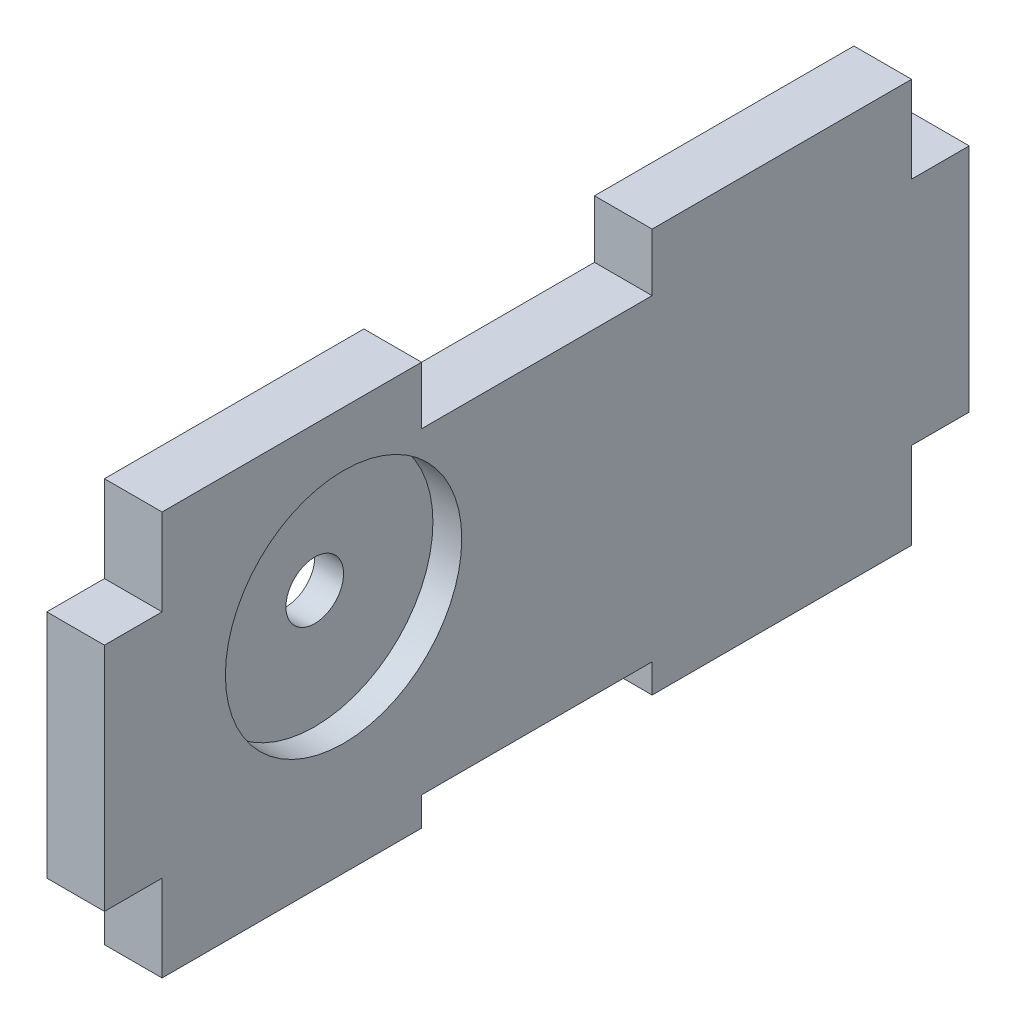
ISO-10303-21;
HEADER;
FILE_DESCRIPTION(('STEP AP214'),'2;1');
FILE_NAME('part.step','',(''),(''),'','','');
FILE_SCHEMA(('AUTOMOTIVE_DESIGN { 1 0 10303 214 1 1 1 1 }'));
ENDSEC;
DATA;
#1=APPLICATION_CONTEXT('core data for automotive mechanical design processes');
#2=APPLICATION_PROTOCOL_DEFINITION('international standard','automotive_design',2000,#1);
#3=PRODUCT_CONTEXT('',#1,'mechanical');
#4=PRODUCT('Part','Part','',(#3));
#5=PRODUCT_RELATED_PRODUCT_CATEGORY('part','',(#4));
#6=PRODUCT_DEFINITION_FORMATION('','',#4);
#7=PRODUCT_DEFINITION_CONTEXT('part definition',#1,'design');
#8=PRODUCT_DEFINITION('design','',#6,#7);
#9=PRODUCT_DEFINITION_SHAPE('','',#8);
#10=(LENGTH_UNIT() NAMED_UNIT(*) SI_UNIT(.MILLI.,.METRE.));
#11=(NAMED_UNIT(*) PLANE_ANGLE_UNIT() SI_UNIT($,.RADIAN.));
#12=(NAMED_UNIT(*) SI_UNIT($,.STERADIAN.) SOLID_ANGLE_UNIT());
#13=UNCERTAINTY_MEASURE_WITH_UNIT(LENGTH_MEASURE(1.E-05),#10,'distance_accuracy_value','');
#14=(GEOMETRIC_REPRESENTATION_CONTEXT(3) GLOBAL_UNCERTAINTY_ASSIGNED_CONTEXT((#13)) GLOBAL_UNIT_ASSIGNED_CONTEXT((#10,
#11,#12)) REPRESENTATION_CONTEXT('',''));
#15=CARTESIAN_POINT('',(0.,0.,0.));
#16=DIRECTION('',(0.,0.,1.));
#17=DIRECTION('',(1.,0.,0.));
#18=AXIS2_PLACEMENT_3D('',#15,#16,#17);
#19=CARTESIAN_POINT('',(10.,0.,55.));
#20=DIRECTION('',(0.,0.,1.));
#21=DIRECTION('',(1.,0.,0.));
#22=AXIS2_PLACEMENT_3D('',#19,#20,#21);
#23=PLANE('',#22);
#24=DIRECTION('',(0.,1.,0.));
#25=VECTOR('',#24,1.);
#26=CARTESIAN_POINT('',(0.,0.,55.));
#27=LINE('',#26,#25);
#28=CARTESIAN_POINT('',(0.,0.,55.));
#29=VERTEX_POINT('',#28);
#30=CARTESIAN_POINT('',(0.,5.00000000000001,55.));
#31=VERTEX_POINT('',#30);
#32=EDGE_CURVE('E201',#29,#31,#27,.T.);
#33=ORIENTED_EDGE('',*,*,#32,.F.);
#34=DIRECTION('',(-1.,0.,0.));
#35=VECTOR('',#34,1.);
#36=CARTESIAN_POINT('',(10.,0.,55.));
#37=LINE('',#36,#35);
#38=CARTESIAN_POINT('',(10.,0.,55.));
#39=VERTEX_POINT('',#38);
#40=EDGE_CURVE('E11',#39,#29,#37,.T.);
#41=ORIENTED_EDGE('',*,*,#40,.F.);
#42=DIRECTION('',(0.,1.,0.));
#43=VECTOR('',#42,1.);
#44=CARTESIAN_POINT('',(10.,0.,55.));
#45=LINE('',#44,#43);
#46=CARTESIAN_POINT('',(10.,5.00000000000001,55.));
#47=VERTEX_POINT('',#46);
#48=EDGE_CURVE('E252',#39,#47,#45,.T.);
#49=ORIENTED_EDGE('',*,*,#48,.T.);
#50=DIRECTION('',(-1.,0.,0.));
#51=VECTOR('',#50,1.);
#52=CARTESIAN_POINT('',(10.,5.00000000000001,55.));
#53=LINE('',#52,#51);
#54=EDGE_CURVE('E122',#47,#31,#53,.T.);
#55=ORIENTED_EDGE('',*,*,#54,.T.);
#56=EDGE_LOOP('',(#33,#41,#49,#55));
#57=FACE_BOUND('',#56,.T.);
#58=ADVANCED_FACE('F35',(#57),#23,.T.);
#59=CARTESIAN_POINT('',(10.,0.,0.));
#60=DIRECTION('',(0.,1.,0.));
#61=DIRECTION('',(0.,0.,1.));
#62=AXIS2_PLACEMENT_3D('',#59,#60,#61);
#63=PLANE('',#62);
#64=DIRECTION('',(0.,0.,-1.));
#65=VECTOR('',#64,1.);
#66=CARTESIAN_POINT('',(0.,0.,0.));
#67=LINE('',#66,#65);
#68=CARTESIAN_POINT('',(0.,0.,10.));
#69=VERTEX_POINT('',#68);
#70=EDGE_CURVE('E204',#29,#69,#67,.T.);
#71=ORIENTED_EDGE('',*,*,#70,.T.);
#72=DIRECTION('',(-1.,0.,0.));
#73=VECTOR('',#72,1.);
#74=CARTESIAN_POINT('',(10.,0.,10.));
#75=LINE('',#74,#73);
#76=CARTESIAN_POINT('',(10.,0.,10.));
#77=VERTEX_POINT('',#76);
#78=EDGE_CURVE('E43',#77,#69,#75,.T.);
#79=ORIENTED_EDGE('',*,*,#78,.F.);
#80=DIRECTION('',(0.,0.,-1.));
#81=VECTOR('',#80,1.);
#82=CARTESIAN_POINT('',(10.,0.,0.));
#83=LINE('',#82,#81);
#84=EDGE_CURVE('E187',#39,#77,#83,.T.);
#85=ORIENTED_EDGE('',*,*,#84,.F.);
#86=ORIENTED_EDGE('',*,*,#40,.T.);
#87=EDGE_LOOP('',(#71,#79,#85,#86));
#88=FACE_BOUND('',#87,.T.);
#89=ADVANCED_FACE('F412',(#88),#63,.F.);
#90=CARTESIAN_POINT('',(10.,0.,10.));
#91=DIRECTION('',(0.,0.,1.));
#92=DIRECTION('',(1.,0.,0.));
#93=AXIS2_PLACEMENT_3D('',#90,#91,#92);
#94=PLANE('',#93);
#95=DIRECTION('',(0.,1.,0.));
#96=VECTOR('',#95,1.);
#97=CARTESIAN_POINT('',(0.,0.,10.));
#98=LINE('',#97,#96);
#99=CARTESIAN_POINT('',(0.,15.,10.));
#100=VERTEX_POINT('',#99);
#101=EDGE_CURVE('E207',#69,#100,#98,.T.);
#102=ORIENTED_EDGE('',*,*,#101,.T.);
#103=DIRECTION('',(-1.,0.,0.));
#104=VECTOR('',#103,1.);
#105=CARTESIAN_POINT('',(10.,15.,10.));
#106=LINE('',#105,#104);
#107=CARTESIAN_POINT('',(10.,15.,10.));
#108=VERTEX_POINT('',#107);
#109=EDGE_CURVE('E283',#108,#100,#106,.T.);
#110=ORIENTED_EDGE('',*,*,#109,.F.);
#111=DIRECTION('',(0.,1.,0.));
#112=VECTOR('',#111,1.);
#113=CARTESIAN_POINT('',(10.,0.,10.));
#114=LINE('',#113,#112);
#115=EDGE_CURVE('E291',#77,#108,#114,.T.);
#116=ORIENTED_EDGE('',*,*,#115,.F.);
#117=ORIENTED_EDGE('',*,*,#78,.T.);
#118=EDGE_LOOP('',(#102,#110,#116,#117));
#119=FACE_BOUND('',#118,.T.);
#120=ADVANCED_FACE('F289',(#119),#94,.F.);
#121=CARTESIAN_POINT('',(10.,15.,0.));
#122=DIRECTION('',(0.,-1.,0.));
#123=DIRECTION('',(0.,0.,-1.));
#124=AXIS2_PLACEMENT_3D('',#121,#122,#123);
#125=PLANE('',#124);
#126=DIRECTION('',(0.,0.,1.));
#127=VECTOR('',#126,1.);
#128=CARTESIAN_POINT('',(0.,15.,0.));
#129=LINE('',#128,#127);
#130=CARTESIAN_POINT('',(0.,15.,0.));
#131=VERTEX_POINT('',#130);
#132=EDGE_CURVE('E210',#131,#100,#129,.T.);
#133=ORIENTED_EDGE('',*,*,#132,.F.);
#134=DIRECTION('',(-1.,0.,0.));
#135=VECTOR('',#134,1.);
#136=CARTESIAN_POINT('',(10.,15.,0.));
#137=LINE('',#136,#135);
#138=CARTESIAN_POINT('',(10.,15.,0.));
#139=VERTEX_POINT('',#138);
#140=EDGE_CURVE('E281',#139,#131,#137,.T.);
#141=ORIENTED_EDGE('',*,*,#140,.F.);
#142=DIRECTION('',(0.,0.,1.));
#143=VECTOR('',#142,1.);
#144=CARTESIAN_POINT('',(10.,15.,0.));
#145=LINE('',#144,#143);
#146=EDGE_CURVE('E303',#139,#108,#145,.T.);
#147=ORIENTED_EDGE('',*,*,#146,.T.);
#148=ORIENTED_EDGE('',*,*,#109,.T.);
#149=EDGE_LOOP('',(#133,#141,#147,#148));
#150=FACE_BOUND('',#149,.T.);
#151=ADVANCED_FACE('F300',(#150),#125,.T.);
#152=CARTESIAN_POINT('',(10.,0.,0.));
#153=DIRECTION('',(0.,0.,-1.));
#154=DIRECTION('',(0.,1.,0.));
#155=AXIS2_PLACEMENT_3D('',#152,#153,#154);
#156=PLANE('',#155);
#157=DIRECTION('',(0.,-1.,0.));
#158=VECTOR('',#157,1.);
#159=CARTESIAN_POINT('',(0.,0.,0.));
#160=LINE('',#159,#158);
#161=CARTESIAN_POINT('',(0.,55.,0.));
#162=VERTEX_POINT('',#161);
#163=EDGE_CURVE('E213',#162,#131,#160,.T.);
#164=ORIENTED_EDGE('',*,*,#163,.F.);
#165=DIRECTION('',(-1.,0.,0.));
#166=VECTOR('',#165,1.);
#167=CARTESIAN_POINT('',(10.,55.,0.));
#168=LINE('',#167,#166);
#169=CARTESIAN_POINT('',(10.,55.,0.));
#170=VERTEX_POINT('',#169);
#171=EDGE_CURVE('E279',#170,#162,#168,.T.);
#172=ORIENTED_EDGE('',*,*,#171,.F.);
#173=DIRECTION('',(0.,-1.,0.));
#174=VECTOR('',#173,1.);
#175=CARTESIAN_POINT('',(10.,0.,0.));
#176=LINE('',#175,#174);
#177=EDGE_CURVE('E306',#170,#139,#176,.T.);
#178=ORIENTED_EDGE('',*,*,#177,.T.);
#179=ORIENTED_EDGE('',*,*,#140,.T.);
#180=EDGE_LOOP('',(#164,#172,#178,#179));
#181=FACE_BOUND('',#180,.T.);
#182=ADVANCED_FACE('F470',(#181),#156,.T.);
#183=CARTESIAN_POINT('',(10.,55.,0.));
#184=DIRECTION('',(0.,-1.,0.));
#185=DIRECTION('',(0.,0.,-1.));
#186=AXIS2_PLACEMENT_3D('',#183,#184,#185);
#187=PLANE('',#186);
#188=DIRECTION('',(0.,0.,1.));
#189=VECTOR('',#188,1.);
#190=CARTESIAN_POINT('',(0.,55.,0.));
#191=LINE('',#190,#189);
#192=CARTESIAN_POINT('',(0.,55.,10.));
#193=VERTEX_POINT('',#192);
#194=EDGE_CURVE('E216',#162,#193,#191,.T.);
#195=ORIENTED_EDGE('',*,*,#194,.T.);
#196=DIRECTION('',(-1.,0.,0.));
#197=VECTOR('',#196,1.);
#198=CARTESIAN_POINT('',(10.,55.,10.));
#199=LINE('',#198,#197);
#200=CARTESIAN_POINT('',(10.,55.,10.));
#201=VERTEX_POINT('',#200);
#202=EDGE_CURVE('E277',#201,#193,#199,.T.);
#203=ORIENTED_EDGE('',*,*,#202,.F.);
#204=DIRECTION('',(0.,0.,1.));
#205=VECTOR('',#204,1.);
#206=CARTESIAN_POINT('',(10.,55.,0.));
#207=LINE('',#206,#205);
#208=EDGE_CURVE('E308',#170,#201,#207,.T.);
#209=ORIENTED_EDGE('',*,*,#208,.F.);
#210=ORIENTED_EDGE('',*,*,#171,.T.);
#211=EDGE_LOOP('',(#195,#203,#209,#210));
#212=FACE_BOUND('',#211,.T.);
#213=ADVANCED_FACE('F466',(#212),#187,.F.);
#214=CARTESIAN_POINT('',(10.,0.,9.99999999999999));
#215=DIRECTION('',(0.,0.,-1.));
#216=DIRECTION('',(0.,1.,0.));
#217=AXIS2_PLACEMENT_3D('',#214,#215,#216);
#218=PLANE('',#217);
#219=DIRECTION('',(0.,-1.,0.));
#220=VECTOR('',#219,1.);
#221=CARTESIAN_POINT('',(0.,0.,9.99999999999999));
#222=LINE('',#221,#220);
#223=CARTESIAN_POINT('',(0.,70.,10.));
#224=VERTEX_POINT('',#223);
#225=EDGE_CURVE('E219',#224,#193,#222,.T.);
#226=ORIENTED_EDGE('',*,*,#225,.F.);
#227=DIRECTION('',(-1.,0.,0.));
#228=VECTOR('',#227,1.);
#229=CARTESIAN_POINT('',(10.,70.,10.));
#230=LINE('',#229,#228);
#231=CARTESIAN_POINT('',(10.,70.,10.));
#232=VERTEX_POINT('',#231);
#233=EDGE_CURVE('E275',#232,#224,#230,.T.);
#234=ORIENTED_EDGE('',*,*,#233,.F.);
#235=DIRECTION('',(0.,-1.,0.));
#236=VECTOR('',#235,1.);
#237=CARTESIAN_POINT('',(10.,0.,9.99999999999999));
#238=LINE('',#237,#236);
#239=EDGE_CURVE('E313',#232,#201,#238,.T.);
#240=ORIENTED_EDGE('',*,*,#239,.T.);
#241=ORIENTED_EDGE('',*,*,#202,.T.);
#242=EDGE_LOOP('',(#226,#234,#240,#241));
#243=FACE_BOUND('',#242,.T.);
#244=ADVANCED_FACE('F463',(#243),#218,.T.);
#245=CARTESIAN_POINT('',(10.,70.,0.));
#246=DIRECTION('',(0.,1.,0.));
#247=DIRECTION('',(0.,0.,1.));
#248=AXIS2_PLACEMENT_3D('',#245,#246,#247);
#249=PLANE('',#248);
#250=DIRECTION('',(0.,0.,-1.));
#251=VECTOR('',#250,1.);
#252=CARTESIAN_POINT('',(0.,70.,0.));
#253=LINE('',#252,#251);
#254=CARTESIAN_POINT('',(0.,70.,55.));
#255=VERTEX_POINT('',#254);
#256=EDGE_CURVE('E222',#255,#224,#253,.T.);
#257=ORIENTED_EDGE('',*,*,#256,.F.);
#258=DIRECTION('',(-1.,0.,0.));
#259=VECTOR('',#258,1.);
#260=CARTESIAN_POINT('',(10.,70.,55.));
#261=LINE('',#260,#259);
#262=CARTESIAN_POINT('',(10.,70.,55.));
#263=VERTEX_POINT('',#262);
#264=EDGE_CURVE('E273',#263,#255,#261,.T.);
#265=ORIENTED_EDGE('',*,*,#264,.F.);
#266=DIRECTION('',(0.,0.,-1.));
#267=VECTOR('',#266,1.);
#268=CARTESIAN_POINT('',(10.,70.,0.));
#269=LINE('',#268,#267);
#270=EDGE_CURVE('E316',#263,#232,#269,.T.);
#271=ORIENTED_EDGE('',*,*,#270,.T.);
#272=ORIENTED_EDGE('',*,*,#233,.T.);
#273=EDGE_LOOP('',(#257,#265,#271,#272));
#274=FACE_BOUND('',#273,.T.);
#275=ADVANCED_FACE('F451',(#274),#249,.T.);
#276=CARTESIAN_POINT('',(10.,0.,55.));
#277=DIRECTION('',(0.,0.,-1.));
#278=DIRECTION('',(-1.,0.,0.));
#279=AXIS2_PLACEMENT_3D('',#276,#277,#278);
#280=PLANE('',#279);
#281=DIRECTION('',(0.,-1.,0.));
#282=VECTOR('',#281,1.);
#283=CARTESIAN_POINT('',(0.,0.,55.));
#284=LINE('',#283,#282);
#285=CARTESIAN_POINT('',(0.,60.,55.));
#286=VERTEX_POINT('',#285);
#287=EDGE_CURVE('E225',#255,#286,#284,.T.);
#288=ORIENTED_EDGE('',*,*,#287,.T.);
#289=DIRECTION('',(-1.,0.,0.));
#290=VECTOR('',#289,1.);
#291=CARTESIAN_POINT('',(10.,60.,55.));
#292=LINE('',#291,#290);
#293=CARTESIAN_POINT('',(10.,60.,55.));
#294=VERTEX_POINT('',#293);
#295=EDGE_CURVE('E271',#294,#286,#292,.T.);
#296=ORIENTED_EDGE('',*,*,#295,.F.);
#297=DIRECTION('',(0.,-1.,0.));
#298=VECTOR('',#297,1.);
#299=CARTESIAN_POINT('',(10.,0.,55.));
#300=LINE('',#299,#298);
#301=EDGE_CURVE('E319',#263,#294,#300,.T.);
#302=ORIENTED_EDGE('',*,*,#301,.F.);
#303=ORIENTED_EDGE('',*,*,#264,.T.);
#304=EDGE_LOOP('',(#288,#296,#302,#303));
#305=FACE_BOUND('',#304,.T.);
#306=ADVANCED_FACE('F458',(#305),#280,.F.);
#307=CARTESIAN_POINT('',(10.,60.,0.));
#308=DIRECTION('',(0.,1.,0.));
#309=DIRECTION('',(0.,0.,1.));
#310=AXIS2_PLACEMENT_3D('',#307,#308,#309);
#311=PLANE('',#310);
#312=DIRECTION('',(0.,0.,-1.));
#313=VECTOR('',#312,1.);
#314=CARTESIAN_POINT('',(0.,60.,0.));
#315=LINE('',#314,#313);
#316=CARTESIAN_POINT('',(0.,60.,95.));
#317=VERTEX_POINT('',#316);
#318=EDGE_CURVE('E229',#317,#286,#315,.T.);
#319=ORIENTED_EDGE('',*,*,#318,.F.);
#320=DIRECTION('',(-1.,0.,0.));
#321=VECTOR('',#320,1.);
#322=CARTESIAN_POINT('',(10.,60.,95.));
#323=LINE('',#322,#321);
#324=CARTESIAN_POINT('',(10.,60.,95.));
#325=VERTEX_POINT('',#324);
#326=EDGE_CURVE('E269',#325,#317,#323,.T.);
#327=ORIENTED_EDGE('',*,*,#326,.F.);
#328=DIRECTION('',(0.,0.,-1.));
#329=VECTOR('',#328,1.);
#330=CARTESIAN_POINT('',(10.,60.,0.));
#331=LINE('',#330,#329);
#332=EDGE_CURVE('E322',#325,#294,#331,.T.);
#333=ORIENTED_EDGE('',*,*,#332,.T.);
#334=ORIENTED_EDGE('',*,*,#295,.T.);
#335=EDGE_LOOP('',(#319,#327,#333,#334));
#336=FACE_BOUND('',#335,.T.);
#337=ADVANCED_FACE('F454',(#336),#311,.T.);
#338=CARTESIAN_POINT('',(10.,0.,95.));
#339=DIRECTION('',(0.,0.,-1.));
#340=DIRECTION('',(-1.,0.,0.));
#341=AXIS2_PLACEMENT_3D('',#338,#339,#340);
#342=PLANE('',#341);
#343=DIRECTION('',(0.,-1.,0.));
#344=VECTOR('',#343,1.);
#345=CARTESIAN_POINT('',(0.,0.,95.));
#346=LINE('',#345,#344);
#347=CARTESIAN_POINT('',(0.,70.,95.));
#348=VERTEX_POINT('',#347);
#349=EDGE_CURVE('E232',#348,#317,#346,.T.);
#350=ORIENTED_EDGE('',*,*,#349,.F.);
#351=DIRECTION('',(-1.,0.,0.));
#352=VECTOR('',#351,1.);
#353=CARTESIAN_POINT('',(10.,70.,95.));
#354=LINE('',#353,#352);
#355=CARTESIAN_POINT('',(10.,70.,95.));
#356=VERTEX_POINT('',#355);
#357=EDGE_CURVE('E267',#356,#348,#354,.T.);
#358=ORIENTED_EDGE('',*,*,#357,.F.);
#359=DIRECTION('',(0.,-1.,0.));
#360=VECTOR('',#359,1.);
#361=CARTESIAN_POINT('',(10.,0.,95.));
#362=LINE('',#361,#360);
#363=EDGE_CURVE('E325',#356,#325,#362,.T.);
#364=ORIENTED_EDGE('',*,*,#363,.T.);
#365=ORIENTED_EDGE('',*,*,#326,.T.);
#366=EDGE_LOOP('',(#350,#358,#364,#365));
#367=FACE_BOUND('',#366,.T.);
#368=ADVANCED_FACE('F449',(#367),#342,.T.);
#369=CARTESIAN_POINT('',(0.,70.,140.));
#370=VERTEX_POINT('',#369);
#371=EDGE_CURVE('E226',#370,#348,#253,.T.);
#372=ORIENTED_EDGE('',*,*,#371,.F.);
#373=DIRECTION('',(-1.,0.,0.));
#374=VECTOR('',#373,1.);
#375=CARTESIAN_POINT('',(10.,70.,140.));
#376=LINE('',#375,#374);
#377=CARTESIAN_POINT('',(10.,70.,140.));
#378=VERTEX_POINT('',#377);
#379=EDGE_CURVE('E265',#378,#370,#376,.T.);
#380=ORIENTED_EDGE('',*,*,#379,.F.);
#381=EDGE_CURVE('E320',#378,#356,#269,.T.);
#382=ORIENTED_EDGE('',*,*,#381,.T.);
#383=ORIENTED_EDGE('',*,*,#357,.T.);
#384=EDGE_LOOP('',(#372,#380,#382,#383));
#385=FACE_BOUND('',#384,.T.);
#386=ADVANCED_FACE('F445',(#385),#249,.T.);
#387=CARTESIAN_POINT('',(10.,0.,140.));
#388=DIRECTION('',(0.,0.,-1.));
#389=DIRECTION('',(-1.,0.,0.));
#390=AXIS2_PLACEMENT_3D('',#387,#388,#389);
#391=PLANE('',#390);
#392=DIRECTION('',(0.,-1.,0.));
#393=VECTOR('',#392,1.);
#394=CARTESIAN_POINT('',(0.,0.,140.));
#395=LINE('',#394,#393);
#396=CARTESIAN_POINT('',(0.,55.,140.));
#397=VERTEX_POINT('',#396);
#398=EDGE_CURVE('E235',#370,#397,#395,.T.);
#399=ORIENTED_EDGE('',*,*,#398,.T.);
#400=DIRECTION('',(-1.,0.,0.));
#401=VECTOR('',#400,1.);
#402=CARTESIAN_POINT('',(10.,55.,140.));
#403=LINE('',#402,#401);
#404=CARTESIAN_POINT('',(10.,55.,140.));
#405=VERTEX_POINT('',#404);
#406=EDGE_CURVE('E263',#405,#397,#403,.T.);
#407=ORIENTED_EDGE('',*,*,#406,.F.);
#408=DIRECTION('',(0.,-1.,0.));
#409=VECTOR('',#408,1.);
#410=CARTESIAN_POINT('',(10.,0.,140.));
#411=LINE('',#410,#409);
#412=EDGE_CURVE('E328',#378,#405,#411,.T.);
#413=ORIENTED_EDGE('',*,*,#412,.F.);
#414=ORIENTED_EDGE('',*,*,#379,.T.);
#415=EDGE_LOOP('',(#399,#407,#413,#414));
#416=FACE_BOUND('',#415,.T.);
#417=ADVANCED_FACE('F441',(#416),#391,.F.);
#418=CARTESIAN_POINT('',(10.,55.,0.));
#419=DIRECTION('',(0.,1.,0.));
#420=DIRECTION('',(0.,0.,1.));
#421=AXIS2_PLACEMENT_3D('',#418,#419,#420);
#422=PLANE('',#421);
#423=DIRECTION('',(0.,0.,-1.));
#424=VECTOR('',#423,1.);
#425=CARTESIAN_POINT('',(0.,55.,0.));
#426=LINE('',#425,#424);
#427=CARTESIAN_POINT('',(0.,55.,150.));
#428=VERTEX_POINT('',#427);
#429=EDGE_CURVE('E238',#428,#397,#426,.T.);
#430=ORIENTED_EDGE('',*,*,#429,.F.);
#431=DIRECTION('',(-1.,0.,0.));
#432=VECTOR('',#431,1.);
#433=CARTESIAN_POINT('',(10.,55.,150.));
#434=LINE('',#433,#432);
#435=CARTESIAN_POINT('',(10.,55.,150.));
#436=VERTEX_POINT('',#435);
#437=EDGE_CURVE('E261',#436,#428,#434,.T.);
#438=ORIENTED_EDGE('',*,*,#437,.F.);
#439=DIRECTION('',(0.,0.,-1.));
#440=VECTOR('',#439,1.);
#441=CARTESIAN_POINT('',(10.,55.,0.));
#442=LINE('',#441,#440);
#443=EDGE_CURVE('E330',#436,#405,#442,.T.);
#444=ORIENTED_EDGE('',*,*,#443,.T.);
#445=ORIENTED_EDGE('',*,*,#406,.T.);
#446=EDGE_LOOP('',(#430,#438,#444,#445));
#447=FACE_BOUND('',#446,.T.);
#448=ADVANCED_FACE('F437',(#447),#422,.T.);
#449=CARTESIAN_POINT('',(10.,0.,150.));
#450=DIRECTION('',(0.,0.,-1.));
#451=DIRECTION('',(0.,1.,0.));
#452=AXIS2_PLACEMENT_3D('',#449,#450,#451);
#453=PLANE('',#452);
#454=DIRECTION('',(0.,-1.,0.));
#455=VECTOR('',#454,1.);
#456=CARTESIAN_POINT('',(0.,0.,150.));
#457=LINE('',#456,#455);
#458=CARTESIAN_POINT('',(0.,15.,150.));
#459=VERTEX_POINT('',#458);
#460=EDGE_CURVE('E241',#428,#459,#457,.T.);
#461=ORIENTED_EDGE('',*,*,#460,.T.);
#462=DIRECTION('',(-1.,0.,0.));
#463=VECTOR('',#462,1.);
#464=CARTESIAN_POINT('',(10.,15.,150.));
#465=LINE('',#464,#463);
#466=CARTESIAN_POINT('',(10.,15.,150.));
#467=VERTEX_POINT('',#466);
#468=EDGE_CURVE('E258',#467,#459,#465,.T.);
#469=ORIENTED_EDGE('',*,*,#468,.F.);
#470=DIRECTION('',(0.,-1.,0.));
#471=VECTOR('',#470,1.);
#472=CARTESIAN_POINT('',(10.,0.,150.));
#473=LINE('',#472,#471);
#474=EDGE_CURVE('E333',#436,#467,#473,.T.);
#475=ORIENTED_EDGE('',*,*,#474,.F.);
#476=ORIENTED_EDGE('',*,*,#437,.T.);
#477=EDGE_LOOP('',(#461,#469,#475,#476));
#478=FACE_BOUND('',#477,.T.);
#479=ADVANCED_FACE('F431',(#478),#453,.F.);
#480=CARTESIAN_POINT('',(10.,15.,0.));
#481=DIRECTION('',(0.,1.,0.));
#482=DIRECTION('',(0.,0.,1.));
#483=AXIS2_PLACEMENT_3D('',#480,#481,#482);
#484=PLANE('',#483);
#485=DIRECTION('',(0.,0.,-1.));
#486=VECTOR('',#485,1.);
#487=CARTESIAN_POINT('',(0.,15.,0.));
#488=LINE('',#487,#486);
#489=CARTESIAN_POINT('',(0.,15.,140.));
#490=VERTEX_POINT('',#489);
#491=EDGE_CURVE('E243',#459,#490,#488,.T.);
#492=ORIENTED_EDGE('',*,*,#491,.T.);
#493=DIRECTION('',(-1.,0.,0.));
#494=VECTOR('',#493,1.);
#495=CARTESIAN_POINT('',(10.,15.,140.));
#496=LINE('',#495,#494);
#497=CARTESIAN_POINT('',(10.,15.,140.));
#498=VERTEX_POINT('',#497);
#499=EDGE_CURVE('E256',#498,#490,#496,.T.);
#500=ORIENTED_EDGE('',*,*,#499,.F.);
#501=DIRECTION('',(0.,0.,-1.));
#502=VECTOR('',#501,1.);
#503=CARTESIAN_POINT('',(10.,15.,0.));
#504=LINE('',#503,#502);
#505=EDGE_CURVE('E334',#467,#498,#504,.T.);
#506=ORIENTED_EDGE('',*,*,#505,.F.);
#507=ORIENTED_EDGE('',*,*,#468,.T.);
#508=EDGE_LOOP('',(#492,#500,#506,#507));
#509=FACE_BOUND('',#508,.T.);
#510=ADVANCED_FACE('F427',(#509),#484,.F.);
#511=CARTESIAN_POINT('',(10.,0.,140.));
#512=DIRECTION('',(0.,0.,1.));
#513=DIRECTION('',(1.,0.,0.));
#514=AXIS2_PLACEMENT_3D('',#511,#512,#513);
#515=PLANE('',#514);
#516=DIRECTION('',(0.,1.,0.));
#517=VECTOR('',#516,1.);
#518=CARTESIAN_POINT('',(0.,0.,140.));
#519=LINE('',#518,#517);
#520=CARTESIAN_POINT('',(0.,0.,140.));
#521=VERTEX_POINT('',#520);
#522=EDGE_CURVE('E246',#521,#490,#519,.T.);
#523=ORIENTED_EDGE('',*,*,#522,.F.);
#524=DIRECTION('',(-1.,0.,0.));
#525=VECTOR('',#524,1.);
#526=CARTESIAN_POINT('',(10.,0.,140.));
#527=LINE('',#526,#525);
#528=CARTESIAN_POINT('',(10.,0.,140.));
#529=VERTEX_POINT('',#528);
#530=EDGE_CURVE('E192',#529,#521,#527,.T.);
#531=ORIENTED_EDGE('',*,*,#530,.F.);
#532=DIRECTION('',(0.,1.,0.));
#533=VECTOR('',#532,1.);
#534=CARTESIAN_POINT('',(10.,0.,140.));
#535=LINE('',#534,#533);
#536=EDGE_CURVE('E184',#529,#498,#535,.T.);
#537=ORIENTED_EDGE('',*,*,#536,.T.);
#538=ORIENTED_EDGE('',*,*,#499,.T.);
#539=EDGE_LOOP('',(#523,#531,#537,#538));
#540=FACE_BOUND('',#539,.T.);
#541=ADVANCED_FACE('F339',(#540),#515,.T.);
#542=CARTESIAN_POINT('',(0.,0.,95.));
#543=VERTEX_POINT('',#542);
#544=EDGE_CURVE('E191',#521,#543,#67,.T.);
#545=ORIENTED_EDGE('',*,*,#544,.T.);
#546=DIRECTION('',(-1.,0.,0.));
#547=VECTOR('',#546,1.);
#548=CARTESIAN_POINT('',(10.,0.,95.));
#549=LINE('',#548,#547);
#550=CARTESIAN_POINT('',(10.,0.,95.));
#551=VERTEX_POINT('',#550);
#552=EDGE_CURVE('E188',#551,#543,#549,.T.);
#553=ORIENTED_EDGE('',*,*,#552,.F.);
#554=EDGE_CURVE('E178',#529,#551,#83,.T.);
#555=ORIENTED_EDGE('',*,*,#554,.F.);
#556=ORIENTED_EDGE('',*,*,#530,.T.);
#557=EDGE_LOOP('',(#545,#553,#555,#556));
#558=FACE_BOUND('',#557,.T.);
#559=ADVANCED_FACE('F189',(#558),#63,.F.);
#560=CARTESIAN_POINT('',(10.,0.,95.));
#561=DIRECTION('',(0.,0.,1.));
#562=DIRECTION('',(1.,0.,0.));
#563=AXIS2_PLACEMENT_3D('',#560,#561,#562);
#564=PLANE('',#563);
#565=DIRECTION('',(0.,1.,0.));
#566=VECTOR('',#565,1.);
#567=CARTESIAN_POINT('',(0.,0.,95.));
#568=LINE('',#567,#566);
#569=CARTESIAN_POINT('',(0.,5.00000000000001,95.));
#570=VERTEX_POINT('',#569);
#571=EDGE_CURVE('E115',#543,#570,#568,.T.);
#572=ORIENTED_EDGE('',*,*,#571,.T.);
#573=DIRECTION('',(-1.,0.,0.));
#574=VECTOR('',#573,1.);
#575=CARTESIAN_POINT('',(10.,5.00000000000001,95.));
#576=LINE('',#575,#574);
#577=CARTESIAN_POINT('',(10.,5.00000000000001,95.));
#578=VERTEX_POINT('',#577);
#579=EDGE_CURVE('E193',#578,#570,#576,.T.);
#580=ORIENTED_EDGE('',*,*,#579,.F.);
#581=DIRECTION('',(0.,1.,0.));
#582=VECTOR('',#581,1.);
#583=CARTESIAN_POINT('',(10.,0.,95.));
#584=LINE('',#583,#582);
#585=EDGE_CURVE('E182',#551,#578,#584,.T.);
#586=ORIENTED_EDGE('',*,*,#585,.F.);
#587=ORIENTED_EDGE('',*,*,#552,.T.);
#588=EDGE_LOOP('',(#572,#580,#586,#587));
#589=FACE_BOUND('',#588,.T.);
#590=ADVANCED_FACE('F195',(#589),#564,.F.);
#591=CARTESIAN_POINT('',(10.,5.00000000000001,0.));
#592=DIRECTION('',(0.,1.,0.));
#593=DIRECTION('',(0.,0.,1.));
#594=AXIS2_PLACEMENT_3D('',#591,#592,#593);
#595=PLANE('',#594);
#596=DIRECTION('',(0.,0.,-1.));
#597=VECTOR('',#596,1.);
#598=CARTESIAN_POINT('',(0.,5.00000000000001,0.));
#599=LINE('',#598,#597);
#600=EDGE_CURVE('E250',#570,#31,#599,.T.);
#601=ORIENTED_EDGE('',*,*,#600,.T.);
#602=ORIENTED_EDGE('',*,*,#54,.F.);
#603=DIRECTION('',(0.,0.,-1.));
#604=VECTOR('',#603,1.);
#605=CARTESIAN_POINT('',(10.,5.00000000000001,0.));
#606=LINE('',#605,#604);
#607=EDGE_CURVE('E51',#578,#47,#606,.T.);
#608=ORIENTED_EDGE('',*,*,#607,.F.);
#609=ORIENTED_EDGE('',*,*,#579,.T.);
#610=EDGE_LOOP('',(#601,#602,#608,#609));
#611=FACE_BOUND('',#610,.T.);
#612=ADVANCED_FACE('F343',(#611),#595,.F.);
#613=CARTESIAN_POINT('',(10.,0.,0.));
#614=DIRECTION('',(1.,0.,0.));
#615=DIRECTION('',(0.,0.,-1.));
#616=AXIS2_PLACEMENT_3D('',#613,#614,#615);
#617=PLANE('',#616);
#618=CARTESIAN_POINT('',(10.,40.,108.52));
#619=DIRECTION('',(1.,0.,0.));
#620=DIRECTION('',(0.,0.,-1.));
#621=AXIS2_PLACEMENT_3D('',#618,#619,#620);
#622=CIRCLE('',#621,20.5);
#623=CARTESIAN_POINT('',(10.,40.,88.02));
#624=VERTEX_POINT('',#623);
#625=EDGE_CURVE('E346',#624,#624,#622,.T.);
#626=ORIENTED_EDGE('',*,*,#625,.F.);
#627=EDGE_LOOP('',(#626));
#628=FACE_BOUND('',#627,.T.);
#629=ORIENTED_EDGE('',*,*,#48,.F.);
#630=ORIENTED_EDGE('',*,*,#84,.T.);
#631=ORIENTED_EDGE('',*,*,#115,.T.);
#632=ORIENTED_EDGE('',*,*,#146,.F.);
#633=ORIENTED_EDGE('',*,*,#177,.F.);
#634=ORIENTED_EDGE('',*,*,#208,.T.);
#635=ORIENTED_EDGE('',*,*,#239,.F.);
#636=ORIENTED_EDGE('',*,*,#270,.F.);
#637=ORIENTED_EDGE('',*,*,#301,.T.);
#638=ORIENTED_EDGE('',*,*,#332,.F.);
#639=ORIENTED_EDGE('',*,*,#363,.F.);
#640=ORIENTED_EDGE('',*,*,#381,.F.);
#641=ORIENTED_EDGE('',*,*,#412,.T.);
#642=ORIENTED_EDGE('',*,*,#443,.F.);
#643=ORIENTED_EDGE('',*,*,#474,.T.);
#644=ORIENTED_EDGE('',*,*,#505,.T.);
#645=ORIENTED_EDGE('',*,*,#536,.F.);
#646=ORIENTED_EDGE('',*,*,#554,.T.);
#647=ORIENTED_EDGE('',*,*,#585,.T.);
#648=ORIENTED_EDGE('',*,*,#607,.T.);
#649=EDGE_LOOP('',(#629,#630,#631,#632,#633,#634,#635,#636,#637,#638,#639,#640,#641,#642,#643,
#644,#645,#646,#647,#648));
#650=FACE_BOUND('',#649,.T.);
#651=ADVANCED_FACE('F180',(#628,#650),#617,.T.);
#652=CARTESIAN_POINT('',(0.,0.,0.));
#653=DIRECTION('',(1.,0.,0.));
#654=DIRECTION('',(0.,0.,-1.));
#655=AXIS2_PLACEMENT_3D('',#652,#653,#654);
#656=PLANE('',#655);
#657=CARTESIAN_POINT('',(0.,26.6744003931607,37.0800960834548));
#658=DIRECTION('',(-1.,0.,0.));
#659=DIRECTION('',(0.,0.,1.));
#660=AXIS2_PLACEMENT_3D('',#657,#658,#659);
#661=CIRCLE('',#660,5.);
#662=CARTESIAN_POINT('',(0.,26.6744003931607,42.0800960834548));
#663=VERTEX_POINT('',#662);
#664=EDGE_CURVE('E364',#663,#663,#661,.T.);
#665=ORIENTED_EDGE('',*,*,#664,.F.);
#666=EDGE_LOOP('',(#665));
#667=FACE_BOUND('',#666,.T.);
#668=CARTESIAN_POINT('',(0.,33.,72.52));
#669=DIRECTION('',(-1.,0.,0.));
#670=DIRECTION('',(0.,0.,1.));
#671=AXIS2_PLACEMENT_3D('',#668,#669,#670);
#672=CIRCLE('',#671,5.00000000000001);
#673=CARTESIAN_POINT('',(0.,33.,77.52));
#674=VERTEX_POINT('',#673);
#675=EDGE_CURVE('E358',#674,#674,#672,.T.);
#676=ORIENTED_EDGE('',*,*,#675,.F.);
#677=EDGE_LOOP('',(#676));
#678=FACE_BOUND('',#677,.T.);
#679=CARTESIAN_POINT('',(0.,40.,108.52));
#680=DIRECTION('',(1.,0.,0.));
#681=DIRECTION('',(0.,0.,-1.));
#682=AXIS2_PLACEMENT_3D('',#679,#680,#681);
#683=CIRCLE('',#682,5.00000000000001);
#684=CARTESIAN_POINT('',(0.,40.,103.52));
#685=VERTEX_POINT('',#684);
#686=EDGE_CURVE('E349',#685,#685,#683,.T.);
#687=ORIENTED_EDGE('',*,*,#686,.T.);
#688=EDGE_LOOP('',(#687));
#689=FACE_BOUND('',#688,.T.);
#690=ORIENTED_EDGE('',*,*,#32,.T.);
#691=ORIENTED_EDGE('',*,*,#600,.F.);
#692=ORIENTED_EDGE('',*,*,#571,.F.);
#693=ORIENTED_EDGE('',*,*,#544,.F.);
#694=ORIENTED_EDGE('',*,*,#522,.T.);
#695=ORIENTED_EDGE('',*,*,#491,.F.);
#696=ORIENTED_EDGE('',*,*,#460,.F.);
#697=ORIENTED_EDGE('',*,*,#429,.T.);
#698=ORIENTED_EDGE('',*,*,#398,.F.);
#699=ORIENTED_EDGE('',*,*,#371,.T.);
#700=ORIENTED_EDGE('',*,*,#349,.T.);
#701=ORIENTED_EDGE('',*,*,#318,.T.);
#702=ORIENTED_EDGE('',*,*,#287,.F.);
#703=ORIENTED_EDGE('',*,*,#256,.T.);
#704=ORIENTED_EDGE('',*,*,#225,.T.);
#705=ORIENTED_EDGE('',*,*,#194,.F.);
#706=ORIENTED_EDGE('',*,*,#163,.T.);
#707=ORIENTED_EDGE('',*,*,#132,.T.);
#708=ORIENTED_EDGE('',*,*,#101,.F.);
#709=ORIENTED_EDGE('',*,*,#70,.F.);
#710=EDGE_LOOP('',(#690,#691,#692,#693,#694,#695,#696,#697,#698,#699,#700,#701,#702,#703,#704,
#705,#706,#707,#708,#709));
#711=FACE_BOUND('',#710,.T.);
#712=ADVANCED_FACE('F295',(#667,#678,#689,#711),#656,.F.);
#713=CARTESIAN_POINT('',(5.,40.,108.52));
#714=DIRECTION('',(1.,0.,0.));
#715=DIRECTION('',(0.,0.,-1.));
#716=AXIS2_PLACEMENT_3D('',#713,#714,#715);
#717=CYLINDRICAL_SURFACE('',#716,20.5);
#718=CARTESIAN_POINT('',(5.,40.,108.52));
#719=DIRECTION('',(1.,0.,0.));
#720=DIRECTION('',(0.,0.,-1.));
#721=AXIS2_PLACEMENT_3D('',#718,#719,#720);
#722=CIRCLE('',#721,20.5);
#723=CARTESIAN_POINT('',(5.,40.,88.02));
#724=VERTEX_POINT('',#723);
#725=EDGE_CURVE('E205',#724,#724,#722,.T.);
#726=ORIENTED_EDGE('',*,*,#725,.F.);
#727=EDGE_LOOP('',(#726));
#728=FACE_BOUND('',#727,.T.);
#729=ORIENTED_EDGE('',*,*,#625,.T.);
#730=EDGE_LOOP('',(#729));
#731=FACE_BOUND('',#730,.T.);
#732=ADVANCED_FACE('F381',(#728,#731),#717,.F.);
#733=CARTESIAN_POINT('',(5.,0.,0.));
#734=DIRECTION('',(1.,0.,0.));
#735=DIRECTION('',(0.,0.,-1.));
#736=AXIS2_PLACEMENT_3D('',#733,#734,#735);
#737=PLANE('',#736);
#738=CARTESIAN_POINT('',(5.,40.,108.52));
#739=DIRECTION('',(1.,0.,0.));
#740=DIRECTION('',(0.,0.,-1.));
#741=AXIS2_PLACEMENT_3D('',#738,#739,#740);
#742=CIRCLE('',#741,5.00000000000001);
#743=CARTESIAN_POINT('',(5.,40.,103.52));
#744=VERTEX_POINT('',#743);
#745=EDGE_CURVE('E352',#744,#744,#742,.T.);
#746=ORIENTED_EDGE('',*,*,#745,.F.);
#747=EDGE_LOOP('',(#746));
#748=FACE_BOUND('',#747,.T.);
#749=ORIENTED_EDGE('',*,*,#725,.T.);
#750=EDGE_LOOP('',(#749));
#751=FACE_BOUND('',#750,.T.);
#752=ADVANCED_FACE('F391',(#748,#751),#737,.T.);
#753=CARTESIAN_POINT('',(0.,40.,108.52));
#754=DIRECTION('',(1.,0.,0.));
#755=DIRECTION('',(0.,0.,-1.));
#756=AXIS2_PLACEMENT_3D('',#753,#754,#755);
#757=CYLINDRICAL_SURFACE('',#756,5.00000000000001);
#758=ORIENTED_EDGE('',*,*,#686,.F.);
#759=EDGE_LOOP('',(#758));
#760=FACE_BOUND('',#759,.T.);
#761=ORIENTED_EDGE('',*,*,#745,.T.);
#762=EDGE_LOOP('',(#761));
#763=FACE_BOUND('',#762,.T.);
#764=ADVANCED_FACE('F387',(#760,#763),#757,.F.);
#765=CARTESIAN_POINT('',(5.,33.,72.52));
#766=DIRECTION('',(-1.,0.,0.));
#767=DIRECTION('',(0.,0.,1.));
#768=AXIS2_PLACEMENT_3D('',#765,#766,#767);
#769=CYLINDRICAL_SURFACE('',#768,5.00000000000001);
#770=CARTESIAN_POINT('',(5.,33.,72.52));
#771=DIRECTION('',(-1.,0.,0.));
#772=DIRECTION('',(0.,0.,1.));
#773=AXIS2_PLACEMENT_3D('',#770,#771,#772);
#774=CIRCLE('',#773,5.00000000000001);
#775=CARTESIAN_POINT('',(5.,33.,77.52));
#776=VERTEX_POINT('',#775);
#777=EDGE_CURVE('E361',#776,#776,#774,.T.);
#778=ORIENTED_EDGE('',*,*,#777,.F.);
#779=EDGE_LOOP('',(#778));
#780=FACE_BOUND('',#779,.T.);
#781=ORIENTED_EDGE('',*,*,#675,.T.);
#782=EDGE_LOOP('',(#781));
#783=FACE_BOUND('',#782,.T.);
#784=ADVANCED_FACE('F390',(#780,#783),#769,.F.);
#785=CARTESIAN_POINT('',(5.,0.,0.));
#786=DIRECTION('',(-1.,0.,0.));
#787=DIRECTION('',(0.,0.,1.));
#788=AXIS2_PLACEMENT_3D('',#785,#786,#787);
#789=PLANE('',#788);
#790=ORIENTED_EDGE('',*,*,#777,.T.);
#791=EDGE_LOOP('',(#790));
#792=FACE_BOUND('',#791,.T.);
#793=ADVANCED_FACE('F375',(#792),#789,.T.);
#794=CARTESIAN_POINT('',(5.,26.6744003931607,37.0800960834548));
#795=DIRECTION('',(-1.,0.,0.));
#796=DIRECTION('',(0.,0.,1.));
#797=AXIS2_PLACEMENT_3D('',#794,#795,#796);
#798=CYLINDRICAL_SURFACE('',#797,5.);
#799=CARTESIAN_POINT('',(5.,26.6744003931607,37.0800960834548));
#800=DIRECTION('',(-1.,0.,0.));
#801=DIRECTION('',(0.,0.,1.));
#802=AXIS2_PLACEMENT_3D('',#799,#800,#801);
#803=CIRCLE('',#802,5.);
#804=CARTESIAN_POINT('',(5.,26.6744003931607,42.0800960834548));
#805=VERTEX_POINT('',#804);
#806=EDGE_CURVE('E355',#805,#805,#803,.T.);
#807=ORIENTED_EDGE('',*,*,#806,.F.);
#808=EDGE_LOOP('',(#807));
#809=FACE_BOUND('',#808,.T.);
#810=ORIENTED_EDGE('',*,*,#664,.T.);
#811=EDGE_LOOP('',(#810));
#812=FACE_BOUND('',#811,.T.);
#813=ADVANCED_FACE('F372',(#809,#812),#798,.F.);
#814=CARTESIAN_POINT('',(5.,0.,0.));
#815=DIRECTION('',(-1.,0.,0.));
#816=DIRECTION('',(0.,0.,1.));
#817=AXIS2_PLACEMENT_3D('',#814,#815,#816);
#818=PLANE('',#817);
#819=ORIENTED_EDGE('',*,*,#806,.T.);
#820=EDGE_LOOP('',(#819));
#821=FACE_BOUND('',#820,.T.);
#822=ADVANCED_FACE('F370',(#821),#818,.T.);
#823=CLOSED_SHELL('',(#58,#89,#120,#151,#182,#213,#244,#275,#306,#337,#368,#386,#417,#448,#479,
#510,#541,#559,#590,#612,#651,#712,#732,#752,#764,#784,#793,#813,#822));
#824=MANIFOLD_SOLID_BREP('B2',#823);
#825=ADVANCED_BREP_SHAPE_REPRESENTATION('',(#18,#824),#14);
#826=SHAPE_DEFINITION_REPRESENTATION(#9,#825);
ENDSEC;
END-ISO-10303-21;
